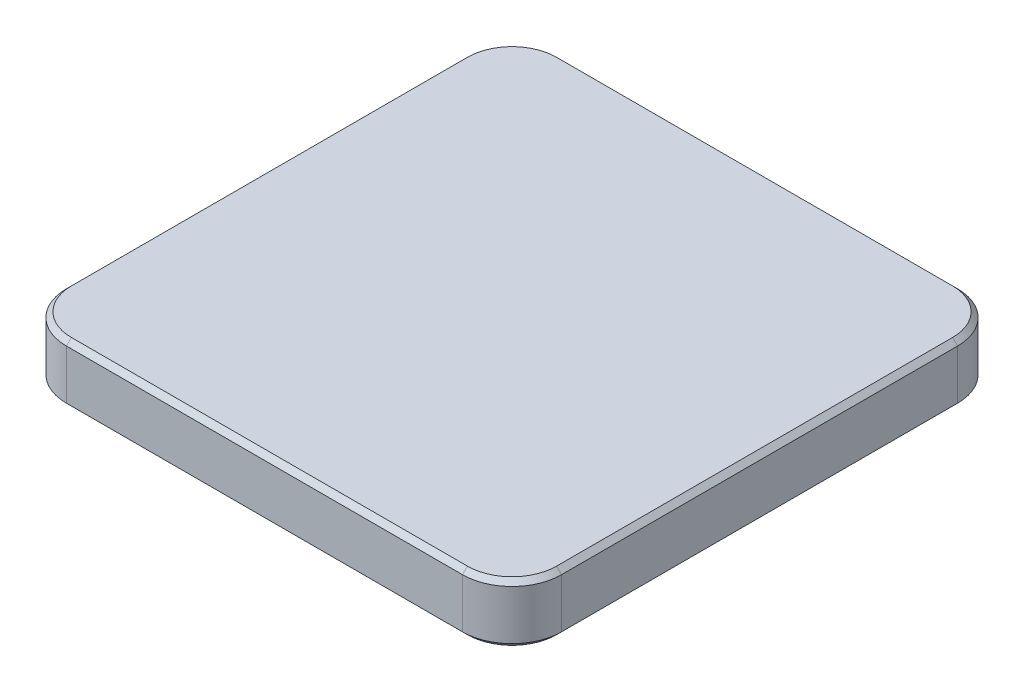
ISO-10303-21;
HEADER;
FILE_DESCRIPTION(('STEP AP214'),'2;1');
FILE_NAME('part.step','',(''),(''),'','','');
FILE_SCHEMA(('AUTOMOTIVE_DESIGN { 1 0 10303 214 1 1 1 1 }'));
ENDSEC;
DATA;
#1=APPLICATION_CONTEXT('core data for automotive mechanical design processes');
#2=APPLICATION_PROTOCOL_DEFINITION('international standard','automotive_design',2000,#1);
#3=PRODUCT_CONTEXT('',#1,'mechanical');
#4=PRODUCT('Part','Part','',(#3));
#5=PRODUCT_RELATED_PRODUCT_CATEGORY('part','',(#4));
#6=PRODUCT_DEFINITION_FORMATION('','',#4);
#7=PRODUCT_DEFINITION_CONTEXT('part definition',#1,'design');
#8=PRODUCT_DEFINITION('design','',#6,#7);
#9=PRODUCT_DEFINITION_SHAPE('','',#8);
#10=(LENGTH_UNIT() NAMED_UNIT(*) SI_UNIT(.MILLI.,.METRE.));
#11=(NAMED_UNIT(*) PLANE_ANGLE_UNIT() SI_UNIT($,.RADIAN.));
#12=(NAMED_UNIT(*) SI_UNIT($,.STERADIAN.) SOLID_ANGLE_UNIT());
#13=UNCERTAINTY_MEASURE_WITH_UNIT(LENGTH_MEASURE(1.E-05),#10,'distance_accuracy_value','');
#14=(GEOMETRIC_REPRESENTATION_CONTEXT(3) GLOBAL_UNCERTAINTY_ASSIGNED_CONTEXT((#13)) GLOBAL_UNIT_ASSIGNED_CONTEXT((#10,
#11,#12)) REPRESENTATION_CONTEXT('',''));
#15=CARTESIAN_POINT('',(0.,0.,0.));
#16=DIRECTION('',(0.,0.,1.));
#17=DIRECTION('',(1.,0.,0.));
#18=AXIS2_PLACEMENT_3D('',#15,#16,#17);
#19=CARTESIAN_POINT('',(-40.,12.,40.));
#20=DIRECTION('',(0.,-1.,0.));
#21=DIRECTION('',(0.,0.,-1.));
#22=AXIS2_PLACEMENT_3D('',#19,#20,#21);
#23=CYLINDRICAL_SURFACE('',#22,9.99999999999999);
#24=DIRECTION('',(0.,-1.,0.));
#25=VECTOR('',#24,1.);
#26=CARTESIAN_POINT('',(-50.,12.,40.));
#27=LINE('',#26,#25);
#28=CARTESIAN_POINT('',(-50.,11.,40.));
#29=VERTEX_POINT('',#28);
#30=CARTESIAN_POINT('',(-50.,1.,40.));
#31=VERTEX_POINT('',#30);
#32=EDGE_CURVE('E163',#29,#31,#27,.T.);
#33=ORIENTED_EDGE('',*,*,#32,.T.);
#34=CARTESIAN_POINT('',(-40.,1.,40.));
#35=DIRECTION('',(0.,-1.,0.));
#36=DIRECTION('',(0.,0.,-1.));
#37=AXIS2_PLACEMENT_3D('',#34,#35,#36);
#38=CIRCLE('',#37,9.99999999999999);
#39=CARTESIAN_POINT('',(-40.,1.,50.));
#40=VERTEX_POINT('',#39);
#41=EDGE_CURVE('E171',#31,#40,#38,.F.);
#42=ORIENTED_EDGE('',*,*,#41,.T.);
#43=DIRECTION('',(0.,-1.,0.));
#44=VECTOR('',#43,1.);
#45=CARTESIAN_POINT('',(-40.,12.,50.));
#46=LINE('',#45,#44);
#47=CARTESIAN_POINT('',(-40.,11.,50.));
#48=VERTEX_POINT('',#47);
#49=EDGE_CURVE('E165',#48,#40,#46,.T.);
#50=ORIENTED_EDGE('',*,*,#49,.F.);
#51=CARTESIAN_POINT('',(-40.,11.,40.));
#52=DIRECTION('',(0.,-1.,0.));
#53=DIRECTION('',(0.,0.,-1.));
#54=AXIS2_PLACEMENT_3D('',#51,#52,#53);
#55=CIRCLE('',#54,9.99999999999999);
#56=EDGE_CURVE('E161',#48,#29,#55,.T.);
#57=ORIENTED_EDGE('',*,*,#56,.T.);
#58=EDGE_LOOP('',(#33,#42,#50,#57));
#59=FACE_BOUND('',#58,.T.);
#60=ADVANCED_FACE('F41',(#59),#23,.T.);
#61=CARTESIAN_POINT('',(40.,12.,50.));
#62=DIRECTION('',(0.,0.,-1.));
#63=DIRECTION('',(-1.,0.,0.));
#64=AXIS2_PLACEMENT_3D('',#61,#62,#63);
#65=PLANE('',#64);
#66=ORIENTED_EDGE('',*,*,#49,.T.);
#67=DIRECTION('',(1.,0.,0.));
#68=VECTOR('',#67,1.);
#69=CARTESIAN_POINT('',(40.,1.,50.));
#70=LINE('',#69,#68);
#71=CARTESIAN_POINT('',(40.,1.,50.));
#72=VERTEX_POINT('',#71);
#73=EDGE_CURVE('E247',#40,#72,#70,.T.);
#74=ORIENTED_EDGE('',*,*,#73,.T.);
#75=DIRECTION('',(0.,-1.,0.));
#76=VECTOR('',#75,1.);
#77=CARTESIAN_POINT('',(40.,12.,50.));
#78=LINE('',#77,#76);
#79=CARTESIAN_POINT('',(40.,11.,50.));
#80=VERTEX_POINT('',#79);
#81=EDGE_CURVE('E209',#80,#72,#78,.T.);
#82=ORIENTED_EDGE('',*,*,#81,.F.);
#83=DIRECTION('',(-1.,0.,0.));
#84=VECTOR('',#83,1.);
#85=CARTESIAN_POINT('',(40.,11.,50.));
#86=LINE('',#85,#84);
#87=EDGE_CURVE('E244',#80,#48,#86,.T.);
#88=ORIENTED_EDGE('',*,*,#87,.T.);
#89=EDGE_LOOP('',(#66,#74,#82,#88));
#90=FACE_BOUND('',#89,.T.);
#91=ADVANCED_FACE('F349',(#90),#65,.F.);
#92=CARTESIAN_POINT('',(40.,12.,40.));
#93=DIRECTION('',(0.,-1.,0.));
#94=DIRECTION('',(0.,0.,-1.));
#95=AXIS2_PLACEMENT_3D('',#92,#93,#94);
#96=CYLINDRICAL_SURFACE('',#95,9.99999999999999);
#97=ORIENTED_EDGE('',*,*,#81,.T.);
#98=CARTESIAN_POINT('',(40.,1.,40.));
#99=DIRECTION('',(0.,-1.,0.));
#100=DIRECTION('',(0.,0.,-1.));
#101=AXIS2_PLACEMENT_3D('',#98,#99,#100);
#102=CIRCLE('',#101,9.99999999999999);
#103=CARTESIAN_POINT('',(50.,1.,40.));
#104=VERTEX_POINT('',#103);
#105=EDGE_CURVE('E260',#72,#104,#102,.F.);
#106=ORIENTED_EDGE('',*,*,#105,.T.);
#107=DIRECTION('',(0.,-1.,0.));
#108=VECTOR('',#107,1.);
#109=CARTESIAN_POINT('',(50.,12.,40.));
#110=LINE('',#109,#108);
#111=CARTESIAN_POINT('',(50.,11.,40.));
#112=VERTEX_POINT('',#111);
#113=EDGE_CURVE('E355',#112,#104,#110,.T.);
#114=ORIENTED_EDGE('',*,*,#113,.F.);
#115=CARTESIAN_POINT('',(40.,11.,40.));
#116=DIRECTION('',(0.,-1.,0.));
#117=DIRECTION('',(0.,0.,-1.));
#118=AXIS2_PLACEMENT_3D('',#115,#116,#117);
#119=CIRCLE('',#118,9.99999999999999);
#120=EDGE_CURVE('E257',#112,#80,#119,.T.);
#121=ORIENTED_EDGE('',*,*,#120,.T.);
#122=EDGE_LOOP('',(#97,#106,#114,#121));
#123=FACE_BOUND('',#122,.T.);
#124=ADVANCED_FACE('F397',(#123),#96,.T.);
#125=CARTESIAN_POINT('',(50.,12.,-40.));
#126=DIRECTION('',(-1.,0.,0.));
#127=DIRECTION('',(0.,0.,1.));
#128=AXIS2_PLACEMENT_3D('',#125,#126,#127);
#129=PLANE('',#128);
#130=ORIENTED_EDGE('',*,*,#113,.T.);
#131=DIRECTION('',(0.,0.,-1.));
#132=VECTOR('',#131,1.);
#133=CARTESIAN_POINT('',(50.,1.,-40.));
#134=LINE('',#133,#132);
#135=CARTESIAN_POINT('',(50.,1.,-40.));
#136=VERTEX_POINT('',#135);
#137=EDGE_CURVE('E272',#104,#136,#134,.T.);
#138=ORIENTED_EDGE('',*,*,#137,.T.);
#139=DIRECTION('',(0.,-1.,0.));
#140=VECTOR('',#139,1.);
#141=CARTESIAN_POINT('',(50.,12.,-40.));
#142=LINE('',#141,#140);
#143=CARTESIAN_POINT('',(50.,11.,-40.));
#144=VERTEX_POINT('',#143);
#145=EDGE_CURVE('E358',#144,#136,#142,.T.);
#146=ORIENTED_EDGE('',*,*,#145,.F.);
#147=DIRECTION('',(0.,0.,1.));
#148=VECTOR('',#147,1.);
#149=CARTESIAN_POINT('',(50.,11.,-40.));
#150=LINE('',#149,#148);
#151=EDGE_CURVE('E269',#144,#112,#150,.T.);
#152=ORIENTED_EDGE('',*,*,#151,.T.);
#153=EDGE_LOOP('',(#130,#138,#146,#152));
#154=FACE_BOUND('',#153,.T.);
#155=ADVANCED_FACE('F400',(#154),#129,.F.);
#156=CARTESIAN_POINT('',(40.,12.,-40.));
#157=DIRECTION('',(0.,-1.,0.));
#158=DIRECTION('',(0.,0.,-1.));
#159=AXIS2_PLACEMENT_3D('',#156,#157,#158);
#160=CYLINDRICAL_SURFACE('',#159,9.99999999999999);
#161=ORIENTED_EDGE('',*,*,#145,.T.);
#162=CARTESIAN_POINT('',(40.,1.,-40.));
#163=DIRECTION('',(0.,-1.,0.));
#164=DIRECTION('',(0.,0.,-1.));
#165=AXIS2_PLACEMENT_3D('',#162,#163,#164);
#166=CIRCLE('',#165,9.99999999999999);
#167=CARTESIAN_POINT('',(40.,1.,-50.));
#168=VERTEX_POINT('',#167);
#169=EDGE_CURVE('E266',#136,#168,#166,.F.);
#170=ORIENTED_EDGE('',*,*,#169,.T.);
#171=DIRECTION('',(0.,-1.,0.));
#172=VECTOR('',#171,1.);
#173=CARTESIAN_POINT('',(40.,12.,-50.));
#174=LINE('',#173,#172);
#175=CARTESIAN_POINT('',(40.,11.,-50.));
#176=VERTEX_POINT('',#175);
#177=EDGE_CURVE('E364',#176,#168,#174,.T.);
#178=ORIENTED_EDGE('',*,*,#177,.F.);
#179=CARTESIAN_POINT('',(40.,11.,-40.));
#180=DIRECTION('',(0.,-1.,0.));
#181=DIRECTION('',(0.,0.,-1.));
#182=AXIS2_PLACEMENT_3D('',#179,#180,#181);
#183=CIRCLE('',#182,9.99999999999999);
#184=EDGE_CURVE('E263',#176,#144,#183,.T.);
#185=ORIENTED_EDGE('',*,*,#184,.T.);
#186=EDGE_LOOP('',(#161,#170,#178,#185));
#187=FACE_BOUND('',#186,.T.);
#188=ADVANCED_FACE('F415',(#187),#160,.T.);
#189=CARTESIAN_POINT('',(-40.,12.,-50.));
#190=DIRECTION('',(0.,0.,1.));
#191=DIRECTION('',(1.,0.,0.));
#192=AXIS2_PLACEMENT_3D('',#189,#190,#191);
#193=PLANE('',#192);
#194=ORIENTED_EDGE('',*,*,#177,.T.);
#195=DIRECTION('',(-1.,0.,0.));
#196=VECTOR('',#195,1.);
#197=CARTESIAN_POINT('',(-40.,1.,-50.));
#198=LINE('',#197,#196);
#199=CARTESIAN_POINT('',(-40.,1.,-50.));
#200=VERTEX_POINT('',#199);
#201=EDGE_CURVE('E254',#168,#200,#198,.T.);
#202=ORIENTED_EDGE('',*,*,#201,.T.);
#203=DIRECTION('',(0.,-1.,0.));
#204=VECTOR('',#203,1.);
#205=CARTESIAN_POINT('',(-40.,12.,-50.));
#206=LINE('',#205,#204);
#207=CARTESIAN_POINT('',(-40.,11.,-50.));
#208=VERTEX_POINT('',#207);
#209=EDGE_CURVE('E368',#208,#200,#206,.T.);
#210=ORIENTED_EDGE('',*,*,#209,.F.);
#211=DIRECTION('',(1.,0.,0.));
#212=VECTOR('',#211,1.);
#213=CARTESIAN_POINT('',(-40.,11.,-50.));
#214=LINE('',#213,#212);
#215=EDGE_CURVE('E250',#208,#176,#214,.T.);
#216=ORIENTED_EDGE('',*,*,#215,.T.);
#217=EDGE_LOOP('',(#194,#202,#210,#216));
#218=FACE_BOUND('',#217,.T.);
#219=ADVANCED_FACE('F417',(#218),#193,.F.);
#220=CARTESIAN_POINT('',(-40.,12.,-40.));
#221=DIRECTION('',(0.,-1.,0.));
#222=DIRECTION('',(0.,0.,-1.));
#223=AXIS2_PLACEMENT_3D('',#220,#221,#222);
#224=CYLINDRICAL_SURFACE('',#223,9.99999999999999);
#225=ORIENTED_EDGE('',*,*,#209,.T.);
#226=CARTESIAN_POINT('',(-40.,1.,-40.));
#227=DIRECTION('',(0.,-1.,0.));
#228=DIRECTION('',(0.,0.,-1.));
#229=AXIS2_PLACEMENT_3D('',#226,#227,#228);
#230=CIRCLE('',#229,9.99999999999999);
#231=CARTESIAN_POINT('',(-50.,1.,-40.));
#232=VERTEX_POINT('',#231);
#233=EDGE_CURVE('E241',#200,#232,#230,.F.);
#234=ORIENTED_EDGE('',*,*,#233,.T.);
#235=DIRECTION('',(0.,-1.,0.));
#236=VECTOR('',#235,1.);
#237=CARTESIAN_POINT('',(-50.,12.,-40.));
#238=LINE('',#237,#236);
#239=CARTESIAN_POINT('',(-50.,11.,-40.));
#240=VERTEX_POINT('',#239);
#241=EDGE_CURVE('E184',#240,#232,#238,.T.);
#242=ORIENTED_EDGE('',*,*,#241,.F.);
#243=CARTESIAN_POINT('',(-40.,11.,-40.));
#244=DIRECTION('',(0.,-1.,0.));
#245=DIRECTION('',(0.,0.,-1.));
#246=AXIS2_PLACEMENT_3D('',#243,#244,#245);
#247=CIRCLE('',#246,9.99999999999999);
#248=EDGE_CURVE('E238',#240,#208,#247,.T.);
#249=ORIENTED_EDGE('',*,*,#248,.T.);
#250=EDGE_LOOP('',(#225,#234,#242,#249));
#251=FACE_BOUND('',#250,.T.);
#252=ADVANCED_FACE('F433',(#251),#224,.T.);
#253=CARTESIAN_POINT('',(-50.,12.,40.));
#254=DIRECTION('',(1.,0.,0.));
#255=DIRECTION('',(0.,0.,-1.));
#256=AXIS2_PLACEMENT_3D('',#253,#254,#255);
#257=PLANE('',#256);
#258=ORIENTED_EDGE('',*,*,#241,.T.);
#259=DIRECTION('',(0.,0.,1.));
#260=VECTOR('',#259,1.);
#261=CARTESIAN_POINT('',(-50.,1.,40.));
#262=LINE('',#261,#260);
#263=EDGE_CURVE('E182',#232,#31,#262,.T.);
#264=ORIENTED_EDGE('',*,*,#263,.T.);
#265=ORIENTED_EDGE('',*,*,#32,.F.);
#266=DIRECTION('',(0.,0.,-1.));
#267=VECTOR('',#266,1.);
#268=CARTESIAN_POINT('',(-50.,11.,40.));
#269=LINE('',#268,#267);
#270=EDGE_CURVE('E179',#29,#240,#269,.T.);
#271=ORIENTED_EDGE('',*,*,#270,.T.);
#272=EDGE_LOOP('',(#258,#264,#265,#271));
#273=FACE_BOUND('',#272,.T.);
#274=ADVANCED_FACE('F177',(#273),#257,.F.);
#275=CARTESIAN_POINT('',(-40.,12.,40.));
#276=DIRECTION('',(0.,-1.,0.));
#277=DIRECTION('',(0.,0.,-1.));
#278=AXIS2_PLACEMENT_3D('',#275,#276,#277);
#279=PLANE('',#278);
#280=CARTESIAN_POINT('',(40.,12.,-40.));
#281=DIRECTION('',(0.,-1.,0.));
#282=DIRECTION('',(0.,0.,-1.));
#283=AXIS2_PLACEMENT_3D('',#280,#281,#282);
#284=CIRCLE('',#283,8.99999999999999);
#285=CARTESIAN_POINT('',(49.,12.,-40.));
#286=VERTEX_POINT('',#285);
#287=CARTESIAN_POINT('',(40.,12.,-49.));
#288=VERTEX_POINT('',#287);
#289=EDGE_CURVE('E67',#286,#288,#284,.F.);
#290=ORIENTED_EDGE('',*,*,#289,.T.);
#291=DIRECTION('',(-1.,0.,0.));
#292=VECTOR('',#291,1.);
#293=CARTESIAN_POINT('',(-40.,12.,-49.));
#294=LINE('',#293,#292);
#295=CARTESIAN_POINT('',(-40.,12.,-49.));
#296=VERTEX_POINT('',#295);
#297=EDGE_CURVE('E11',#288,#296,#294,.T.);
#298=ORIENTED_EDGE('',*,*,#297,.T.);
#299=CARTESIAN_POINT('',(-40.,12.,-40.));
#300=DIRECTION('',(0.,-1.,0.));
#301=DIRECTION('',(0.,0.,-1.));
#302=AXIS2_PLACEMENT_3D('',#299,#300,#301);
#303=CIRCLE('',#302,8.99999999999999);
#304=CARTESIAN_POINT('',(-49.,12.,-40.));
#305=VERTEX_POINT('',#304);
#306=EDGE_CURVE('E52',#296,#305,#303,.F.);
#307=ORIENTED_EDGE('',*,*,#306,.T.);
#308=DIRECTION('',(0.,0.,1.));
#309=VECTOR('',#308,1.);
#310=CARTESIAN_POINT('',(-49.,12.,40.));
#311=LINE('',#310,#309);
#312=CARTESIAN_POINT('',(-49.,12.,40.));
#313=VERTEX_POINT('',#312);
#314=EDGE_CURVE('E286',#305,#313,#311,.T.);
#315=ORIENTED_EDGE('',*,*,#314,.T.);
#316=CARTESIAN_POINT('',(-40.,12.,40.));
#317=DIRECTION('',(0.,-1.,0.));
#318=DIRECTION('',(0.,0.,-1.));
#319=AXIS2_PLACEMENT_3D('',#316,#317,#318);
#320=CIRCLE('',#319,8.99999999999999);
#321=CARTESIAN_POINT('',(-40.,12.,49.));
#322=VERTEX_POINT('',#321);
#323=EDGE_CURVE('E191',#313,#322,#320,.F.);
#324=ORIENTED_EDGE('',*,*,#323,.T.);
#325=DIRECTION('',(1.,0.,0.));
#326=VECTOR('',#325,1.);
#327=CARTESIAN_POINT('',(-40.,12.,49.));
#328=LINE('',#327,#326);
#329=CARTESIAN_POINT('',(40.,12.,49.));
#330=VERTEX_POINT('',#329);
#331=EDGE_CURVE('E275',#322,#330,#328,.T.);
#332=ORIENTED_EDGE('',*,*,#331,.T.);
#333=CARTESIAN_POINT('',(40.,12.,40.));
#334=DIRECTION('',(0.,-1.,0.));
#335=DIRECTION('',(0.,0.,-1.));
#336=AXIS2_PLACEMENT_3D('',#333,#334,#335);
#337=CIRCLE('',#336,8.99999999999999);
#338=CARTESIAN_POINT('',(49.,12.,40.));
#339=VERTEX_POINT('',#338);
#340=EDGE_CURVE('E278',#330,#339,#337,.F.);
#341=ORIENTED_EDGE('',*,*,#340,.T.);
#342=DIRECTION('',(0.,0.,-1.));
#343=VECTOR('',#342,1.);
#344=CARTESIAN_POINT('',(49.,12.,40.));
#345=LINE('',#344,#343);
#346=EDGE_CURVE('E283',#339,#286,#345,.T.);
#347=ORIENTED_EDGE('',*,*,#346,.T.);
#348=EDGE_LOOP('',(#290,#298,#307,#315,#324,#332,#341,#347));
#349=FACE_BOUND('',#348,.T.);
#350=ADVANCED_FACE('F423',(#349),#279,.F.);
#351=CARTESIAN_POINT('',(-40.,0.,40.));
#352=DIRECTION('',(0.,-1.,0.));
#353=DIRECTION('',(0.,0.,-1.));
#354=AXIS2_PLACEMENT_3D('',#351,#352,#353);
#355=PLANE('',#354);
#356=CARTESIAN_POINT('',(-40.,0.,40.));
#357=DIRECTION('',(0.,-1.,0.));
#358=DIRECTION('',(0.,0.,-1.));
#359=AXIS2_PLACEMENT_3D('',#356,#357,#358);
#360=CIRCLE('',#359,8.99999999999999);
#361=CARTESIAN_POINT('',(-40.,0.,49.));
#362=VERTEX_POINT('',#361);
#363=CARTESIAN_POINT('',(-49.,0.,40.));
#364=VERTEX_POINT('',#363);
#365=EDGE_CURVE('E230',#362,#364,#360,.T.);
#366=ORIENTED_EDGE('',*,*,#365,.T.);
#367=DIRECTION('',(0.,0.,-1.));
#368=VECTOR('',#367,1.);
#369=CARTESIAN_POINT('',(-49.,0.,-40.));
#370=LINE('',#369,#368);
#371=CARTESIAN_POINT('',(-49.,0.,-40.));
#372=VERTEX_POINT('',#371);
#373=EDGE_CURVE('E172',#364,#372,#370,.T.);
#374=ORIENTED_EDGE('',*,*,#373,.T.);
#375=CARTESIAN_POINT('',(-40.,0.,-40.));
#376=DIRECTION('',(0.,-1.,0.));
#377=DIRECTION('',(0.,0.,-1.));
#378=AXIS2_PLACEMENT_3D('',#375,#376,#377);
#379=CIRCLE('',#378,8.99999999999999);
#380=CARTESIAN_POINT('',(-40.,0.,-49.));
#381=VERTEX_POINT('',#380);
#382=EDGE_CURVE('E227',#372,#381,#379,.T.);
#383=ORIENTED_EDGE('',*,*,#382,.T.);
#384=DIRECTION('',(1.,0.,0.));
#385=VECTOR('',#384,1.);
#386=CARTESIAN_POINT('',(40.,0.,-49.));
#387=LINE('',#386,#385);
#388=CARTESIAN_POINT('',(40.,0.,-49.));
#389=VERTEX_POINT('',#388);
#390=EDGE_CURVE('E221',#381,#389,#387,.T.);
#391=ORIENTED_EDGE('',*,*,#390,.T.);
#392=CARTESIAN_POINT('',(40.,0.,-40.));
#393=DIRECTION('',(0.,-1.,0.));
#394=DIRECTION('',(0.,0.,-1.));
#395=AXIS2_PLACEMENT_3D('',#392,#393,#394);
#396=CIRCLE('',#395,8.99999999999999);
#397=CARTESIAN_POINT('',(49.,0.,-40.));
#398=VERTEX_POINT('',#397);
#399=EDGE_CURVE('E215',#389,#398,#396,.T.);
#400=ORIENTED_EDGE('',*,*,#399,.T.);
#401=DIRECTION('',(0.,0.,1.));
#402=VECTOR('',#401,1.);
#403=CARTESIAN_POINT('',(49.,0.,40.));
#404=LINE('',#403,#402);
#405=CARTESIAN_POINT('',(49.,0.,40.));
#406=VERTEX_POINT('',#405);
#407=EDGE_CURVE('E207',#398,#406,#404,.T.);
#408=ORIENTED_EDGE('',*,*,#407,.T.);
#409=CARTESIAN_POINT('',(40.,0.,40.));
#410=DIRECTION('',(0.,-1.,0.));
#411=DIRECTION('',(0.,0.,-1.));
#412=AXIS2_PLACEMENT_3D('',#409,#410,#411);
#413=CIRCLE('',#412,8.99999999999999);
#414=CARTESIAN_POINT('',(40.,0.,49.));
#415=VERTEX_POINT('',#414);
#416=EDGE_CURVE('E218',#406,#415,#413,.T.);
#417=ORIENTED_EDGE('',*,*,#416,.T.);
#418=DIRECTION('',(-1.,0.,0.));
#419=VECTOR('',#418,1.);
#420=CARTESIAN_POINT('',(-40.,0.,49.));
#421=LINE('',#420,#419);
#422=EDGE_CURVE('E224',#415,#362,#421,.T.);
#423=ORIENTED_EDGE('',*,*,#422,.T.);
#424=EDGE_LOOP('',(#366,#374,#383,#391,#400,#408,#417,#423));
#425=FACE_BOUND('',#424,.T.);
#426=ADVANCED_FACE('F425',(#425),#355,.T.);
#427=CARTESIAN_POINT('',(50.,1.,-40.));
#428=DIRECTION('',(0.707106781186547,-0.707106781186547,0.));
#429=DIRECTION('',(0.,0.,1.));
#430=AXIS2_PLACEMENT_3D('',#427,#428,#429);
#431=PLANE('',#430);
#432=DIRECTION('',(0.707106781186547,0.707106781186547,0.));
#433=VECTOR('',#432,1.);
#434=CARTESIAN_POINT('',(49.,0.,40.));
#435=LINE('',#434,#433);
#436=EDGE_CURVE('E315',#406,#104,#435,.T.);
#437=ORIENTED_EDGE('',*,*,#436,.F.);
#438=ORIENTED_EDGE('',*,*,#407,.F.);
#439=DIRECTION('',(-0.707106781186547,-0.707106781186547,0.));
#440=VECTOR('',#439,1.);
#441=CARTESIAN_POINT('',(50.,1.,-40.));
#442=LINE('',#441,#440);
#443=EDGE_CURVE('E185',#136,#398,#442,.T.);
#444=ORIENTED_EDGE('',*,*,#443,.F.);
#445=ORIENTED_EDGE('',*,*,#137,.F.);
#446=EDGE_LOOP('',(#437,#438,#444,#445));
#447=FACE_BOUND('',#446,.T.);
#448=ADVANCED_FACE('F405',(#447),#431,.T.);
#449=CARTESIAN_POINT('',(40.,1.,-40.));
#450=DIRECTION('',(0.,1.,0.));
#451=DIRECTION('',(0.,0.,1.));
#452=AXIS2_PLACEMENT_3D('',#449,#450,#451);
#453=CONICAL_SURFACE('',#452,9.99999999999999,0.78539816339745);
#454=ORIENTED_EDGE('',*,*,#443,.T.);
#455=ORIENTED_EDGE('',*,*,#399,.F.);
#456=DIRECTION('',(0.,-0.707106781186547,0.707106781186547));
#457=VECTOR('',#456,1.);
#458=CARTESIAN_POINT('',(40.,1.,-50.));
#459=LINE('',#458,#457);
#460=EDGE_CURVE('E311',#168,#389,#459,.T.);
#461=ORIENTED_EDGE('',*,*,#460,.F.);
#462=ORIENTED_EDGE('',*,*,#169,.F.);
#463=EDGE_LOOP('',(#454,#455,#461,#462));
#464=FACE_BOUND('',#463,.T.);
#465=ADVANCED_FACE('F411',(#464),#453,.T.);
#466=CARTESIAN_POINT('',(40.,1.,40.));
#467=DIRECTION('',(0.,1.,0.));
#468=DIRECTION('',(0.,0.,1.));
#469=AXIS2_PLACEMENT_3D('',#466,#467,#468);
#470=CONICAL_SURFACE('',#469,9.99999999999999,0.785398163397447);
#471=ORIENTED_EDGE('',*,*,#436,.T.);
#472=ORIENTED_EDGE('',*,*,#105,.F.);
#473=DIRECTION('',(0.,0.70710678118655,0.707106781186545));
#474=VECTOR('',#473,1.);
#475=CARTESIAN_POINT('',(40.,0.,49.));
#476=LINE('',#475,#474);
#477=EDGE_CURVE('E307',#415,#72,#476,.T.);
#478=ORIENTED_EDGE('',*,*,#477,.F.);
#479=ORIENTED_EDGE('',*,*,#416,.F.);
#480=EDGE_LOOP('',(#471,#472,#478,#479));
#481=FACE_BOUND('',#480,.T.);
#482=ADVANCED_FACE('F394',(#481),#470,.T.);
#483=CARTESIAN_POINT('',(-40.,1.,-50.));
#484=DIRECTION('',(0.,-0.707106781186547,-0.707106781186547));
#485=DIRECTION('',(1.,0.,0.));
#486=AXIS2_PLACEMENT_3D('',#483,#484,#485);
#487=PLANE('',#486);
#488=ORIENTED_EDGE('',*,*,#460,.T.);
#489=ORIENTED_EDGE('',*,*,#390,.F.);
#490=DIRECTION('',(0.,-0.707106781186547,0.707106781186547));
#491=VECTOR('',#490,1.);
#492=CARTESIAN_POINT('',(-40.,1.,-50.));
#493=LINE('',#492,#491);
#494=EDGE_CURVE('E303',#200,#381,#493,.T.);
#495=ORIENTED_EDGE('',*,*,#494,.F.);
#496=ORIENTED_EDGE('',*,*,#201,.F.);
#497=EDGE_LOOP('',(#488,#489,#495,#496));
#498=FACE_BOUND('',#497,.T.);
#499=ADVANCED_FACE('F464',(#498),#487,.T.);
#500=CARTESIAN_POINT('',(40.,1.,50.));
#501=DIRECTION('',(0.,-0.707106781186547,0.707106781186547));
#502=DIRECTION('',(-1.,0.,0.));
#503=AXIS2_PLACEMENT_3D('',#500,#501,#502);
#504=PLANE('',#503);
#505=ORIENTED_EDGE('',*,*,#477,.T.);
#506=ORIENTED_EDGE('',*,*,#73,.F.);
#507=DIRECTION('',(0.,0.707106781186547,0.707106781186547));
#508=VECTOR('',#507,1.);
#509=CARTESIAN_POINT('',(-40.,0.,49.));
#510=LINE('',#509,#508);
#511=EDGE_CURVE('E299',#362,#40,#510,.T.);
#512=ORIENTED_EDGE('',*,*,#511,.F.);
#513=ORIENTED_EDGE('',*,*,#422,.F.);
#514=EDGE_LOOP('',(#505,#506,#512,#513));
#515=FACE_BOUND('',#514,.T.);
#516=ADVANCED_FACE('F390',(#515),#504,.T.);
#517=CARTESIAN_POINT('',(-40.,1.,-40.));
#518=DIRECTION('',(0.,1.,0.));
#519=DIRECTION('',(0.,0.,1.));
#520=AXIS2_PLACEMENT_3D('',#517,#518,#519);
#521=CONICAL_SURFACE('',#520,9.99999999999999,0.785398163397448);
#522=ORIENTED_EDGE('',*,*,#494,.T.);
#523=ORIENTED_EDGE('',*,*,#382,.F.);
#524=DIRECTION('',(0.707106781186547,-0.707106781186547,0.));
#525=VECTOR('',#524,1.);
#526=CARTESIAN_POINT('',(-50.,1.,-40.));
#527=LINE('',#526,#525);
#528=EDGE_CURVE('E296',#232,#372,#527,.T.);
#529=ORIENTED_EDGE('',*,*,#528,.F.);
#530=ORIENTED_EDGE('',*,*,#233,.F.);
#531=EDGE_LOOP('',(#522,#523,#529,#530));
#532=FACE_BOUND('',#531,.T.);
#533=ADVANCED_FACE('F378',(#532),#521,.T.);
#534=CARTESIAN_POINT('',(-40.,1.,40.));
#535=DIRECTION('',(0.,1.,0.));
#536=DIRECTION('',(0.,0.,1.));
#537=AXIS2_PLACEMENT_3D('',#534,#535,#536);
#538=CONICAL_SURFACE('',#537,9.99999999999999,0.785398163397448);
#539=ORIENTED_EDGE('',*,*,#511,.T.);
#540=ORIENTED_EDGE('',*,*,#41,.F.);
#541=DIRECTION('',(-0.707106781186547,0.707106781186547,0.));
#542=VECTOR('',#541,1.);
#543=CARTESIAN_POINT('',(-49.,0.,40.));
#544=LINE('',#543,#542);
#545=EDGE_CURVE('E293',#364,#31,#544,.T.);
#546=ORIENTED_EDGE('',*,*,#545,.F.);
#547=ORIENTED_EDGE('',*,*,#365,.F.);
#548=EDGE_LOOP('',(#539,#540,#546,#547));
#549=FACE_BOUND('',#548,.T.);
#550=ADVANCED_FACE('F386',(#549),#538,.T.);
#551=CARTESIAN_POINT('',(-50.,1.,40.));
#552=DIRECTION('',(-0.707106781186547,-0.707106781186547,0.));
#553=DIRECTION('',(0.,0.,-1.));
#554=AXIS2_PLACEMENT_3D('',#551,#552,#553);
#555=PLANE('',#554);
#556=ORIENTED_EDGE('',*,*,#528,.T.);
#557=ORIENTED_EDGE('',*,*,#373,.F.);
#558=ORIENTED_EDGE('',*,*,#545,.T.);
#559=ORIENTED_EDGE('',*,*,#263,.F.);
#560=EDGE_LOOP('',(#556,#557,#558,#559));
#561=FACE_BOUND('',#560,.T.);
#562=ADVANCED_FACE('F381',(#561),#555,.T.);
#563=CARTESIAN_POINT('',(-40.,12.,49.));
#564=DIRECTION('',(0.,-0.707106781186547,-0.707106781186547));
#565=DIRECTION('',(1.,0.,0.));
#566=AXIS2_PLACEMENT_3D('',#563,#564,#565);
#567=PLANE('',#566);
#568=DIRECTION('',(0.,0.707106781186547,-0.707106781186547));
#569=VECTOR('',#568,1.);
#570=CARTESIAN_POINT('',(-40.,11.,50.));
#571=LINE('',#570,#569);
#572=EDGE_CURVE('E334',#48,#322,#571,.T.);
#573=ORIENTED_EDGE('',*,*,#572,.F.);
#574=ORIENTED_EDGE('',*,*,#87,.F.);
#575=DIRECTION('',(0.,-0.707106781186547,0.707106781186547));
#576=VECTOR('',#575,1.);
#577=CARTESIAN_POINT('',(40.,12.,49.));
#578=LINE('',#577,#576);
#579=EDGE_CURVE('E46',#330,#80,#578,.T.);
#580=ORIENTED_EDGE('',*,*,#579,.F.);
#581=ORIENTED_EDGE('',*,*,#331,.F.);
#582=EDGE_LOOP('',(#573,#574,#580,#581));
#583=FACE_BOUND('',#582,.T.);
#584=ADVANCED_FACE('F44',(#583),#567,.F.);
#585=CARTESIAN_POINT('',(40.,12.,40.));
#586=DIRECTION('',(0.,-1.,0.));
#587=DIRECTION('',(0.,0.,-1.));
#588=AXIS2_PLACEMENT_3D('',#585,#586,#587);
#589=CONICAL_SURFACE('',#588,8.99999999999999,0.78539816339745);
#590=ORIENTED_EDGE('',*,*,#579,.T.);
#591=ORIENTED_EDGE('',*,*,#120,.F.);
#592=DIRECTION('',(0.70710678118655,-0.707106781186545,0.));
#593=VECTOR('',#592,1.);
#594=CARTESIAN_POINT('',(49.,12.,40.));
#595=LINE('',#594,#593);
#596=EDGE_CURVE('E195',#339,#112,#595,.T.);
#597=ORIENTED_EDGE('',*,*,#596,.F.);
#598=ORIENTED_EDGE('',*,*,#340,.F.);
#599=EDGE_LOOP('',(#590,#591,#597,#598));
#600=FACE_BOUND('',#599,.T.);
#601=ADVANCED_FACE('F342',(#600),#589,.T.);
#602=CARTESIAN_POINT('',(-40.,12.,40.));
#603=DIRECTION('',(0.,-1.,0.));
#604=DIRECTION('',(0.,0.,-1.));
#605=AXIS2_PLACEMENT_3D('',#602,#603,#604);
#606=CONICAL_SURFACE('',#605,8.99999999999999,0.785398163397448);
#607=ORIENTED_EDGE('',*,*,#572,.T.);
#608=ORIENTED_EDGE('',*,*,#323,.F.);
#609=DIRECTION('',(0.707106781186547,0.707106781186547,0.));
#610=VECTOR('',#609,1.);
#611=CARTESIAN_POINT('',(-50.,11.,40.));
#612=LINE('',#611,#610);
#613=EDGE_CURVE('E189',#29,#313,#612,.T.);
#614=ORIENTED_EDGE('',*,*,#613,.F.);
#615=ORIENTED_EDGE('',*,*,#56,.F.);
#616=EDGE_LOOP('',(#607,#608,#614,#615));
#617=FACE_BOUND('',#616,.T.);
#618=ADVANCED_FACE('F190',(#617),#606,.T.);
#619=CARTESIAN_POINT('',(49.,12.,40.));
#620=DIRECTION('',(-0.707106781186547,-0.707106781186547,0.));
#621=DIRECTION('',(0.,0.,-1.));
#622=AXIS2_PLACEMENT_3D('',#619,#620,#621);
#623=PLANE('',#622);
#624=ORIENTED_EDGE('',*,*,#596,.T.);
#625=ORIENTED_EDGE('',*,*,#151,.F.);
#626=DIRECTION('',(0.707106781186547,-0.707106781186547,0.));
#627=VECTOR('',#626,1.);
#628=CARTESIAN_POINT('',(49.,12.,-40.));
#629=LINE('',#628,#627);
#630=EDGE_CURVE('E196',#286,#144,#629,.T.);
#631=ORIENTED_EDGE('',*,*,#630,.F.);
#632=ORIENTED_EDGE('',*,*,#346,.F.);
#633=EDGE_LOOP('',(#624,#625,#631,#632));
#634=FACE_BOUND('',#633,.T.);
#635=ADVANCED_FACE('F508',(#634),#623,.F.);
#636=CARTESIAN_POINT('',(-49.,12.,40.));
#637=DIRECTION('',(0.707106781186547,-0.707106781186547,0.));
#638=DIRECTION('',(0.,0.,1.));
#639=AXIS2_PLACEMENT_3D('',#636,#637,#638);
#640=PLANE('',#639);
#641=ORIENTED_EDGE('',*,*,#613,.T.);
#642=ORIENTED_EDGE('',*,*,#314,.F.);
#643=DIRECTION('',(0.707106781186547,0.707106781186547,0.));
#644=VECTOR('',#643,1.);
#645=CARTESIAN_POINT('',(-50.,11.,-40.));
#646=LINE('',#645,#644);
#647=EDGE_CURVE('E201',#240,#305,#646,.T.);
#648=ORIENTED_EDGE('',*,*,#647,.F.);
#649=ORIENTED_EDGE('',*,*,#270,.F.);
#650=EDGE_LOOP('',(#641,#642,#648,#649));
#651=FACE_BOUND('',#650,.T.);
#652=ADVANCED_FACE('F199',(#651),#640,.F.);
#653=CARTESIAN_POINT('',(40.,12.,-40.));
#654=DIRECTION('',(0.,-1.,0.));
#655=DIRECTION('',(0.,0.,-1.));
#656=AXIS2_PLACEMENT_3D('',#653,#654,#655);
#657=CONICAL_SURFACE('',#656,8.99999999999999,0.785398163397447);
#658=ORIENTED_EDGE('',*,*,#630,.T.);
#659=ORIENTED_EDGE('',*,*,#184,.F.);
#660=DIRECTION('',(0.,-0.70710678118655,-0.707106781186545));
#661=VECTOR('',#660,1.);
#662=CARTESIAN_POINT('',(40.,12.,-49.));
#663=LINE('',#662,#661);
#664=EDGE_CURVE('E324',#288,#176,#663,.T.);
#665=ORIENTED_EDGE('',*,*,#664,.F.);
#666=ORIENTED_EDGE('',*,*,#289,.F.);
#667=EDGE_LOOP('',(#658,#659,#665,#666));
#668=FACE_BOUND('',#667,.T.);
#669=ADVANCED_FACE('F496',(#668),#657,.T.);
#670=CARTESIAN_POINT('',(-40.,12.,-40.));
#671=DIRECTION('',(0.,-1.,0.));
#672=DIRECTION('',(0.,0.,-1.));
#673=AXIS2_PLACEMENT_3D('',#670,#671,#672);
#674=CONICAL_SURFACE('',#673,8.99999999999999,0.785398163397448);
#675=ORIENTED_EDGE('',*,*,#647,.T.);
#676=ORIENTED_EDGE('',*,*,#306,.F.);
#677=DIRECTION('',(0.,0.707106781186547,0.707106781186547));
#678=VECTOR('',#677,1.);
#679=CARTESIAN_POINT('',(-40.,11.,-50.));
#680=LINE('',#679,#678);
#681=EDGE_CURVE('E60',#208,#296,#680,.T.);
#682=ORIENTED_EDGE('',*,*,#681,.F.);
#683=ORIENTED_EDGE('',*,*,#248,.F.);
#684=EDGE_LOOP('',(#675,#676,#682,#683));
#685=FACE_BOUND('',#684,.T.);
#686=ADVANCED_FACE('F422',(#685),#674,.T.);
#687=CARTESIAN_POINT('',(-40.,12.,-49.));
#688=DIRECTION('',(0.,-0.707106781186547,0.707106781186547));
#689=DIRECTION('',(-1.,0.,0.));
#690=AXIS2_PLACEMENT_3D('',#687,#688,#689);
#691=PLANE('',#690);
#692=ORIENTED_EDGE('',*,*,#664,.T.);
#693=ORIENTED_EDGE('',*,*,#215,.F.);
#694=ORIENTED_EDGE('',*,*,#681,.T.);
#695=ORIENTED_EDGE('',*,*,#297,.F.);
#696=EDGE_LOOP('',(#692,#693,#694,#695));
#697=FACE_BOUND('',#696,.T.);
#698=ADVANCED_FACE('F419',(#697),#691,.F.);
#699=CLOSED_SHELL('',(#60,#91,#124,#155,#188,#219,#252,#274,#350,#426,#448,#465,#482,#499,#516,
#533,#550,#562,#584,#601,#618,#635,#652,#669,#686,#698));
#700=MANIFOLD_SOLID_BREP('B2',#699);
#701=ADVANCED_BREP_SHAPE_REPRESENTATION('',(#18,#700),#14);
#702=SHAPE_DEFINITION_REPRESENTATION(#9,#701);
ENDSEC;
END-ISO-10303-21;
